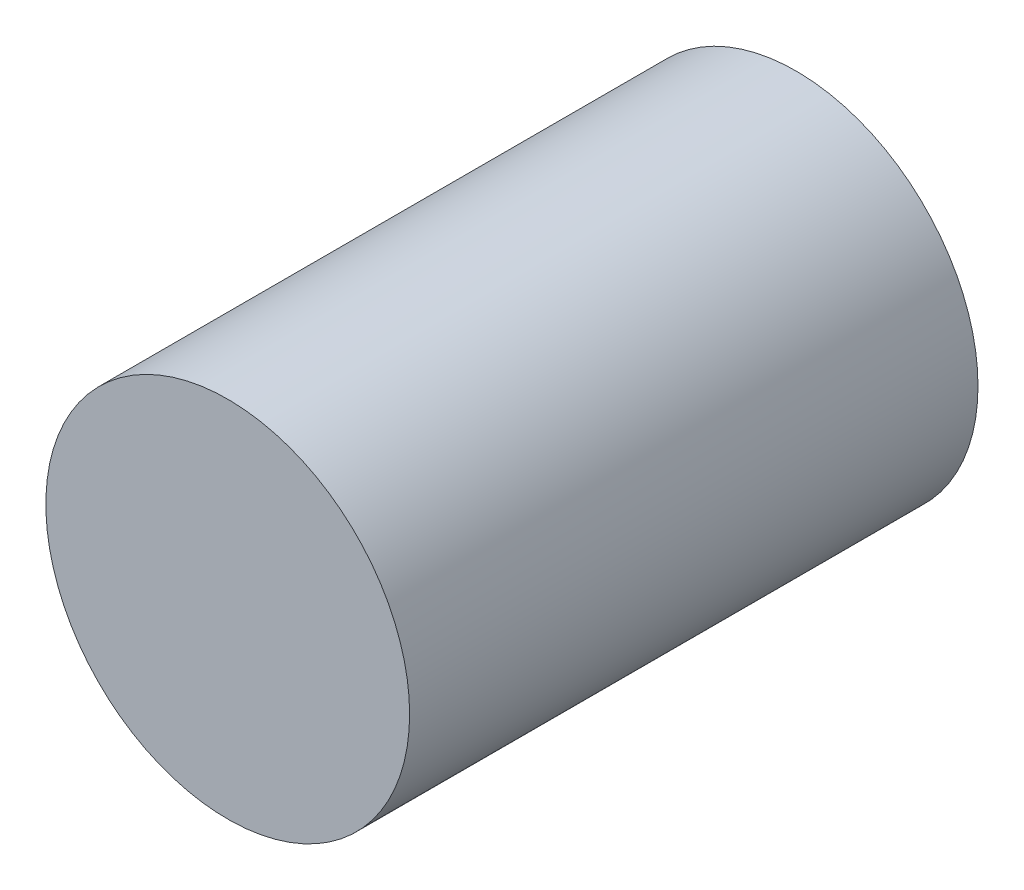
ISO-10303-21;
HEADER;
FILE_DESCRIPTION(('STEP AP214'),'2;1');
FILE_NAME('part.step','',(''),(''),'','','');
FILE_SCHEMA(('AUTOMOTIVE_DESIGN { 1 0 10303 214 1 1 1 1 }'));
ENDSEC;
DATA;
#1=APPLICATION_CONTEXT('core data for automotive mechanical design processes');
#2=APPLICATION_PROTOCOL_DEFINITION('international standard','automotive_design',2000,#1);
#3=PRODUCT_CONTEXT('',#1,'mechanical');
#4=PRODUCT('Part','Part','',(#3));
#5=PRODUCT_RELATED_PRODUCT_CATEGORY('part','',(#4));
#6=PRODUCT_DEFINITION_FORMATION('','',#4);
#7=PRODUCT_DEFINITION_CONTEXT('part definition',#1,'design');
#8=PRODUCT_DEFINITION('design','',#6,#7);
#9=PRODUCT_DEFINITION_SHAPE('','',#8);
#10=(LENGTH_UNIT() NAMED_UNIT(*) SI_UNIT(.MILLI.,.METRE.));
#11=(NAMED_UNIT(*) PLANE_ANGLE_UNIT() SI_UNIT($,.RADIAN.));
#12=(NAMED_UNIT(*) SI_UNIT($,.STERADIAN.) SOLID_ANGLE_UNIT());
#13=UNCERTAINTY_MEASURE_WITH_UNIT(LENGTH_MEASURE(1.E-05),#10,'distance_accuracy_value','');
#14=(GEOMETRIC_REPRESENTATION_CONTEXT(3) GLOBAL_UNCERTAINTY_ASSIGNED_CONTEXT((#13)) GLOBAL_UNIT_ASSIGNED_CONTEXT((#10,
#11,#12)) REPRESENTATION_CONTEXT('',''));
#15=CARTESIAN_POINT('',(0.,0.,0.));
#16=DIRECTION('',(0.,0.,1.));
#17=DIRECTION('',(1.,0.,0.));
#18=AXIS2_PLACEMENT_3D('',#15,#16,#17);
#19=CARTESIAN_POINT('',(0.,0.,25.));
#20=DIRECTION('',(0.,0.,-1.));
#21=DIRECTION('',(-1.,0.,0.));
#22=AXIS2_PLACEMENT_3D('',#19,#20,#21);
#23=CYLINDRICAL_SURFACE('',#22,8.);
#24=CARTESIAN_POINT('',(0.,0.,25.));
#25=DIRECTION('',(0.,0.,1.));
#26=DIRECTION('',(1.,0.,0.));
#27=AXIS2_PLACEMENT_3D('',#24,#25,#26);
#28=CIRCLE('',#27,8.);
#29=CARTESIAN_POINT('',(8.,0.,25.));
#30=VERTEX_POINT('',#29);
#31=EDGE_CURVE('E10',#30,#30,#28,.T.);
#32=ORIENTED_EDGE('',*,*,#31,.F.);
#33=EDGE_LOOP('',(#32));
#34=FACE_BOUND('',#33,.T.);
#35=CARTESIAN_POINT('',(0.,0.,0.));
#36=DIRECTION('',(0.,0.,1.));
#37=DIRECTION('',(1.,0.,0.));
#38=AXIS2_PLACEMENT_3D('',#35,#36,#37);
#39=CIRCLE('',#38,8.);
#40=CARTESIAN_POINT('',(8.,0.,0.));
#41=VERTEX_POINT('',#40);
#42=EDGE_CURVE('E34',#41,#41,#39,.T.);
#43=ORIENTED_EDGE('',*,*,#42,.T.);
#44=EDGE_LOOP('',(#43));
#45=FACE_BOUND('',#44,.T.);
#46=ADVANCED_FACE('F31',(#34,#45),#23,.T.);
#47=CARTESIAN_POINT('',(0.,0.,25.));
#48=DIRECTION('',(0.,0.,1.));
#49=DIRECTION('',(1.,0.,0.));
#50=AXIS2_PLACEMENT_3D('',#47,#48,#49);
#51=PLANE('',#50);
#52=ORIENTED_EDGE('',*,*,#31,.T.);
#53=EDGE_LOOP('',(#52));
#54=FACE_BOUND('',#53,.T.);
#55=ADVANCED_FACE('F46',(#54),#51,.T.);
#56=CARTESIAN_POINT('',(0.,0.,0.));
#57=DIRECTION('',(0.,0.,1.));
#58=DIRECTION('',(1.,0.,0.));
#59=AXIS2_PLACEMENT_3D('',#56,#57,#58);
#60=PLANE('',#59);
#61=ORIENTED_EDGE('',*,*,#42,.F.);
#62=EDGE_LOOP('',(#61));
#63=FACE_BOUND('',#62,.T.);
#64=ADVANCED_FACE('F44',(#63),#60,.F.);
#65=CLOSED_SHELL('',(#46,#55,#64));
#66=MANIFOLD_SOLID_BREP('B2',#65);
#67=ADVANCED_BREP_SHAPE_REPRESENTATION('',(#18,#66),#14);
#68=SHAPE_DEFINITION_REPRESENTATION(#9,#67);
ENDSEC;
END-ISO-10303-21;
